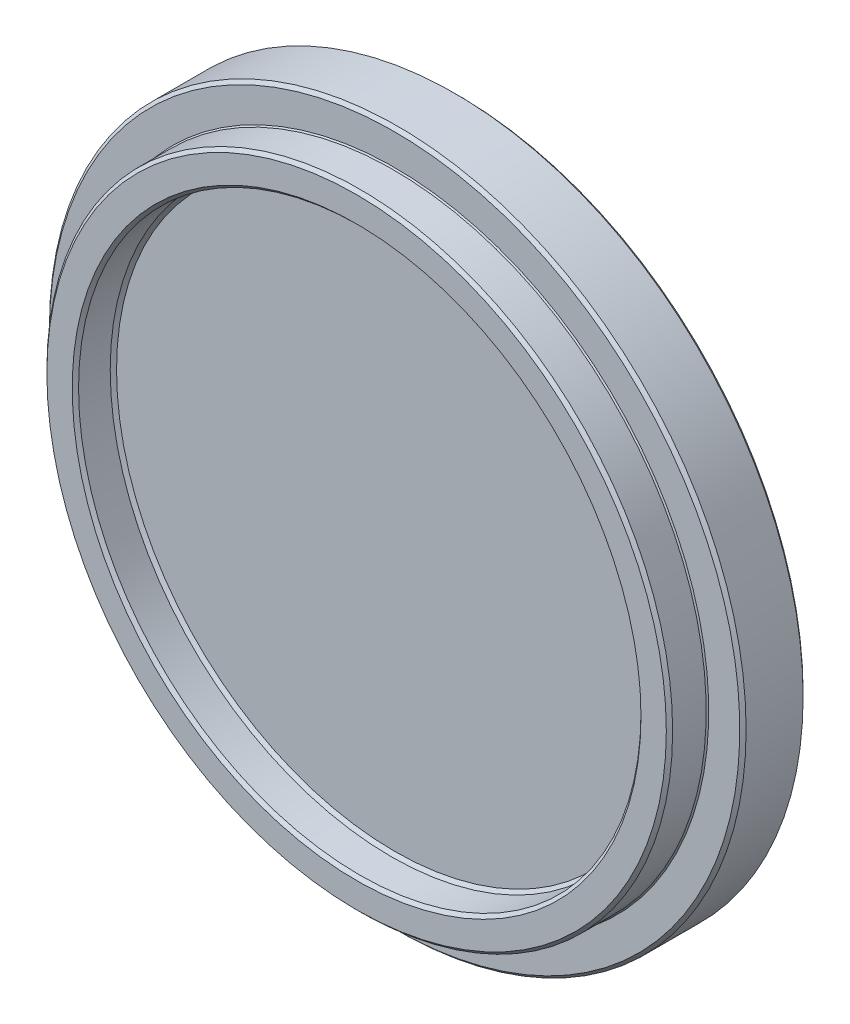
ISO-10303-21;
HEADER;
FILE_DESCRIPTION(('STEP AP214'),'2;1');
FILE_NAME('part.step','',(''),(''),'','','');
FILE_SCHEMA(('AUTOMOTIVE_DESIGN { 1 0 10303 214 1 1 1 1 }'));
ENDSEC;
DATA;
#1=APPLICATION_CONTEXT('core data for automotive mechanical design processes');
#2=APPLICATION_PROTOCOL_DEFINITION('international standard','automotive_design',2000,#1);
#3=PRODUCT_CONTEXT('',#1,'mechanical');
#4=PRODUCT('Part','Part','',(#3));
#5=PRODUCT_RELATED_PRODUCT_CATEGORY('part','',(#4));
#6=PRODUCT_DEFINITION_FORMATION('','',#4);
#7=PRODUCT_DEFINITION_CONTEXT('part definition',#1,'design');
#8=PRODUCT_DEFINITION('design','',#6,#7);
#9=PRODUCT_DEFINITION_SHAPE('','',#8);
#10=(LENGTH_UNIT() NAMED_UNIT(*) SI_UNIT(.MILLI.,.METRE.));
#11=(NAMED_UNIT(*) PLANE_ANGLE_UNIT() SI_UNIT($,.RADIAN.));
#12=(NAMED_UNIT(*) SI_UNIT($,.STERADIAN.) SOLID_ANGLE_UNIT());
#13=UNCERTAINTY_MEASURE_WITH_UNIT(LENGTH_MEASURE(1.E-05),#10,'distance_accuracy_value','');
#14=(GEOMETRIC_REPRESENTATION_CONTEXT(3) GLOBAL_UNCERTAINTY_ASSIGNED_CONTEXT((#13)) GLOBAL_UNIT_ASSIGNED_CONTEXT((#10,
#11,#12)) REPRESENTATION_CONTEXT('',''));
#15=CARTESIAN_POINT('',(0.,0.,0.));
#16=DIRECTION('',(0.,0.,1.));
#17=DIRECTION('',(1.,0.,0.));
#18=AXIS2_PLACEMENT_3D('',#15,#16,#17);
#19=CARTESIAN_POINT('',(0.0434435544244694,-0.0805622683892294,53.331012105136));
#20=DIRECTION('',(0.,0.,1.));
#21=DIRECTION('',(1.,0.,0.));
#22=AXIS2_PLACEMENT_3D('',#19,#20,#21);
#23=CYLINDRICAL_SURFACE('',#22,34.742856);
#24=CARTESIAN_POINT('',(0.0434435544244694,-0.0805622683892294,43.0167267301359));
#25=DIRECTION('',(0.,0.,1.));
#26=DIRECTION('',(1.,0.,0.));
#27=AXIS2_PLACEMENT_3D('',#24,#25,#26);
#28=CIRCLE('',#27,34.742856);
#29=CARTESIAN_POINT('',(34.7862995544245,-0.0805622683892294,43.0167267301359));
#30=VERTEX_POINT('',#29);
#31=EDGE_CURVE('E312',#30,#30,#28,.F.);
#32=ORIENTED_EDGE('',*,*,#31,.T.);
#33=EDGE_LOOP('',(#32));
#34=FACE_BOUND('',#33,.T.);
#35=CARTESIAN_POINT('',(-34.6782480958933,1.13194421694885,47.7985520332425));
#36=CARTESIAN_POINT('',(-34.4015014029592,9.05694375592085,47.1781438903853));
#37=CARTESIAN_POINT('',(-30.7136328158565,16.077045728757,46.5577357475282));
#38=CARTESIAN_POINT('',(-27.0257642287538,23.0971477015931,45.937327604671));
#39=CARTESIAN_POINT('',(-20.6572013498982,27.8219348166724,45.3169194618139));
#40=CARTESIAN_POINT('',(-14.2886384710427,32.5467219317518,44.6965113189568));
#41=CARTESIAN_POINT('',(-6.50075328388984,34.0403921552217,44.0761031760996));
#42=CARTESIAN_POINT('',(-2.65624503685832,34.7777460522653,43.7698372047324));
#43=CARTESIAN_POINT('',(1.25595003961298,34.6411293819338,43.4556950332545));
#44=(BOUNDED_CURVE() B_SPLINE_CURVE(2,(#35,#36,#37,#38,#39,#40,#41,#42,#43),.UNSPECIFIED.,.F.,
.F.) B_SPLINE_CURVE_WITH_KNOTS((3,2,2,2,3),(0.,0.0714285714285714,0.142857142857143,
0.214285714285714,0.249999999999317),
.UNSPECIFIED.) CURVE() GEOMETRIC_REPRESENTATION_ITEM() RATIONAL_B_SPLINE_CURVE((1.,
0.974927912181824,1.,0.974927912181824,1.,0.974927912181824,1.,0.987463956091152,0.987463956090912)) REPRESENTATION_ITEM(''));
#45=CARTESIAN_POINT('',(1.25595003961153,34.6411293819338,43.4556950332545));
#46=VERTEX_POINT('',#45);
#47=CARTESIAN_POINT('',(-34.5980988454337,2.5707738467735,47.6852980051359));
#48=VERTEX_POINT('',#47);
#49=EDGE_CURVE('E111',#46,#48,#44,.F.);
#50=ORIENTED_EDGE('',*,*,#49,.T.);
#51=CARTESIAN_POINT('',(0.0434435544244694,-0.0805622683892294,47.6852980051359));
#52=DIRECTION('',(0.,0.,1.));
#53=DIRECTION('',(1.,0.,0.));
#54=AXIS2_PLACEMENT_3D('',#51,#52,#53);
#55=CIRCLE('',#54,34.742856);
#56=CARTESIAN_POINT('',(1.25595003970553,34.6411293819306,47.6852980051359));
#57=VERTEX_POINT('',#56);
#58=EDGE_CURVE('E113',#48,#57,#55,.T.);
#59=ORIENTED_EDGE('',*,*,#58,.T.);
#60=DIRECTION('',(0.,0.,1.));
#61=VECTOR('',#60,1.);
#62=CARTESIAN_POINT('',(1.25595003970553,34.6411293819306,53.331012105136));
#63=LINE('',#62,#61);
#64=EDGE_CURVE('E109',#57,#46,#63,.F.);
#65=ORIENTED_EDGE('',*,*,#64,.T.);
#66=EDGE_LOOP('',(#50,#59,#65));
#67=FACE_BOUND('',#66,.T.);
#68=ADVANCED_FACE('F53',(#34,#67),#23,.F.);
#69=CARTESIAN_POINT('',(0.0434435544244694,-0.0805622683892294,47.902440855136));
#70=DIRECTION('',(0.,0.,1.));
#71=DIRECTION('',(1.,0.,0.));
#72=AXIS2_PLACEMENT_3D('',#69,#70,#71);
#73=PLANE('',#72);
#74=DIRECTION('',(-0.999390828730885,0.0348994476832326,0.));
#75=VECTOR('',#74,1.);
#76=CARTESIAN_POINT('',(0.0434435544244694,-0.0805622683892288,47.902440855136));
#77=LINE('',#76,#75);
#78=CARTESIAN_POINT('',(-28.7972615726208,0.926575930994717,47.902440855136));
#79=VERTEX_POINT('',#78);
#80=CARTESIAN_POINT('',(-34.4612375230789,1.12436605141549,47.902440855136));
#81=VERTEX_POINT('',#80);
#82=EDGE_CURVE('E116',#79,#81,#77,.T.);
#83=ORIENTED_EDGE('',*,*,#82,.F.);
#84=CARTESIAN_POINT('',(0.0434435544244694,-0.0805622683892294,47.902440855136));
#85=DIRECTION('',(0.,0.,1.));
#86=DIRECTION('',(1.,0.,0.));
#87=AXIS2_PLACEMENT_3D('',#84,#85,#86);
#88=CIRCLE('',#87,28.858284765);
#89=CARTESIAN_POINT('',(1.05058175371679,28.7601428586592,47.902440855136));
#90=VERTEX_POINT('',#89);
#91=EDGE_CURVE('E317',#79,#90,#88,.T.);
#92=ORIENTED_EDGE('',*,*,#91,.T.);
#93=DIRECTION('',(0.0348994476801973,0.999390828730991,0.));
#94=VECTOR('',#93,1.);
#95=CARTESIAN_POINT('',(0.043443554420435,-0.0805622683890885,47.902440855136));
#96=LINE('',#95,#94);
#97=CARTESIAN_POINT('',(1.24837187412036,34.4241188091179,47.902440855136));
#98=VERTEX_POINT('',#97);
#99=EDGE_CURVE('E117',#90,#98,#96,.T.);
#100=ORIENTED_EDGE('',*,*,#99,.T.);
#101=CARTESIAN_POINT('',(0.0434435544244694,-0.0805622683892294,47.902440855136));
#102=DIRECTION('',(0.,0.,1.));
#103=DIRECTION('',(1.,0.,0.));
#104=AXIS2_PLACEMENT_3D('',#101,#102,#103);
#105=CIRCLE('',#104,34.52571315);
#106=EDGE_CURVE('E315',#98,#81,#105,.F.);
#107=ORIENTED_EDGE('',*,*,#106,.T.);
#108=EDGE_LOOP('',(#83,#92,#100,#107));
#109=FACE_BOUND('',#108,.T.);
#110=ADVANCED_FACE('F174',(#109),#73,.F.);
#111=CARTESIAN_POINT('',(0.0434435544244694,-0.0805622683892294,53.331012105136));
#112=DIRECTION('',(0.,0.,1.));
#113=DIRECTION('',(1.,0.,0.));
#114=AXIS2_PLACEMENT_3D('',#111,#112,#113);
#115=CYLINDRICAL_SURFACE('',#114,28.641141915);
#116=CARTESIAN_POINT('',(0.0434435544244694,-0.0805622683892294,43.016726730136));
#117=DIRECTION('',(0.,0.,1.));
#118=DIRECTION('',(1.,0.,0.));
#119=AXIS2_PLACEMENT_3D('',#116,#117,#118);
#120=CIRCLE('',#119,28.641141915);
#121=CARTESIAN_POINT('',(28.6845854694245,-0.0805622683892294,43.016726730136));
#122=VERTEX_POINT('',#121);
#123=EDGE_CURVE('E306',#122,#122,#120,.T.);
#124=ORIENTED_EDGE('',*,*,#123,.T.);
#125=EDGE_LOOP('',(#124));
#126=FACE_BOUND('',#125,.T.);
#127=DIRECTION('',(0.,0.,1.));
#128=VECTOR('',#127,1.);
#129=CARTESIAN_POINT('',(1.04300358823655,28.5431322858429,53.331012105136));
#130=LINE('',#129,#128);
#131=CARTESIAN_POINT('',(1.04300358815175,28.5431322858458,43.4556950332545));
#132=VERTEX_POINT('',#131);
#133=CARTESIAN_POINT('',(1.04300358823655,28.5431322858429,47.685298005136));
#134=VERTEX_POINT('',#133);
#135=EDGE_CURVE('E131',#132,#134,#130,.T.);
#136=ORIENTED_EDGE('',*,*,#135,.T.);
#137=CARTESIAN_POINT('',(0.0434435544244694,-0.0805622683892294,47.685298005136));
#138=DIRECTION('',(0.,0.,1.));
#139=DIRECTION('',(1.,0.,0.));
#140=AXIS2_PLACEMENT_3D('',#137,#138,#139);
#141=CIRCLE('',#140,28.641141915);
#142=CARTESIAN_POINT('',(-28.5141779614586,2.10513294154774,47.685298005136));
#143=VERTEX_POINT('',#142);
#144=EDGE_CURVE('E339',#134,#143,#141,.F.);
#145=ORIENTED_EDGE('',*,*,#144,.T.);
#146=CARTESIAN_POINT('',(-28.5802509998063,0.918997765461354,47.7985520332425));
#147=CARTESIAN_POINT('',(-28.3521079448187,7.45216926040139,47.1781438903853));
#148=CARTESIAN_POINT('',(-25.3119212783259,13.2393658242582,46.5577357475282));
#149=CARTESIAN_POINT('',(-22.2717346118331,19.0265623881149,45.937327604671));
#150=CARTESIAN_POINT('',(-17.0216505885766,22.9215587661085,45.3169194618139));
#151=CARTESIAN_POINT('',(-11.7715665653201,26.816555144102,44.6965113189568));
#152=CARTESIAN_POINT('',(-5.35142871416089,28.047899534575,44.0761031760996));
#153=CARTESIAN_POINT('',(-2.18211222801428,28.6557556534503,43.7698372047324));
#154=CARTESIAN_POINT('',(1.04300358815175,28.5431322858458,43.4556950332545));
#155=(BOUNDED_CURVE() B_SPLINE_CURVE(2,(#146,#147,#148,#149,#150,#151,#152,#153,#154),
.UNSPECIFIED.,.F.,.F.) B_SPLINE_CURVE_WITH_KNOTS((3,2,2,2,3),(0.,0.0714285714285714,
0.142857142857143,0.214285714285714,0.249999999999317),
.UNSPECIFIED.) CURVE() GEOMETRIC_REPRESENTATION_ITEM() RATIONAL_B_SPLINE_CURVE((1.,
0.974927912181824,1.,0.974927912181824,1.,0.974927912181824,1.,0.987463956091152,0.987463956090912)) REPRESENTATION_ITEM(''));
#156=EDGE_CURVE('E327',#143,#132,#155,.T.);
#157=ORIENTED_EDGE('',*,*,#156,.T.);
#158=EDGE_LOOP('',(#136,#145,#157));
#159=FACE_BOUND('',#158,.T.);
#160=ADVANCED_FACE('F171',(#126,#159),#115,.T.);
#161=CARTESIAN_POINT('',(0.0434435544244372,-0.0805622683892294,42.473869605136));
#162=DIRECTION('',(0.,0.,1.));
#163=DIRECTION('',(1.,0.,0.));
#164=AXIS2_PLACEMENT_3D('',#161,#162,#163);
#165=PLANE('',#164);
#166=CARTESIAN_POINT('',(0.0434435544244694,-0.0805622683892294,42.473869605136));
#167=DIRECTION('',(0.,0.,1.));
#168=DIRECTION('',(1.,0.,0.));
#169=AXIS2_PLACEMENT_3D('',#166,#167,#168);
#170=CIRCLE('',#169,35.285713125);
#171=CARTESIAN_POINT('',(35.3291566794244,-0.0805622683892294,42.473869605136));
#172=VERTEX_POINT('',#171);
#173=EDGE_CURVE('E309',#172,#172,#170,.T.);
#174=ORIENTED_EDGE('',*,*,#173,.T.);
#175=EDGE_LOOP('',(#174));
#176=FACE_BOUND('',#175,.T.);
#177=CARTESIAN_POINT('',(0.0434435544244694,-0.0805622683892294,42.473869605136));
#178=DIRECTION('',(0.,0.,1.));
#179=DIRECTION('',(1.,0.,0.));
#180=AXIS2_PLACEMENT_3D('',#177,#178,#179);
#181=CIRCLE('',#180,59.171426626291);
#182=CARTESIAN_POINT('',(59.2148701807155,-0.0805622683892294,42.473869605136));
#183=VERTEX_POINT('',#182);
#184=EDGE_CURVE('E545',#183,#183,#181,.F.);
#185=ORIENTED_EDGE('',*,*,#184,.T.);
#186=EDGE_LOOP('',(#185));
#187=FACE_BOUND('',#186,.T.);
#188=ADVANCED_FACE('F169',(#176,#187),#165,.F.);
#189=CARTESIAN_POINT('',(0.0434435544244694,-0.0805622683892294,42.4738696051359));
#190=DIRECTION('',(0.,0.,1.));
#191=DIRECTION('',(1.,0.,0.));
#192=AXIS2_PLACEMENT_3D('',#189,#190,#191);
#193=PLANE('',#192);
#194=CARTESIAN_POINT('',(0.0434435544244694,-0.0805622683892294,42.4738696051359));
#195=DIRECTION('',(0.,0.,1.));
#196=DIRECTION('',(1.,0.,0.));
#197=AXIS2_PLACEMENT_3D('',#194,#195,#196);
#198=CIRCLE('',#197,20.4114279);
#199=CARTESIAN_POINT('',(20.4548714544245,-0.0805622683892294,42.4738696051359));
#200=VERTEX_POINT('',#199);
#201=EDGE_CURVE('E300',#200,#200,#198,.T.);
#202=ORIENTED_EDGE('',*,*,#201,.T.);
#203=EDGE_LOOP('',(#202));
#204=FACE_BOUND('',#203,.T.);
#205=CARTESIAN_POINT('',(0.0434435544244694,-0.0805622683892294,42.4738696051359));
#206=DIRECTION('',(0.,0.,1.));
#207=DIRECTION('',(1.,0.,0.));
#208=AXIS2_PLACEMENT_3D('',#205,#206,#207);
#209=CIRCLE('',#208,28.09828479);
#210=CARTESIAN_POINT('',(28.1417283444245,-0.0805622683892294,42.4738696051359));
#211=VERTEX_POINT('',#210);
#212=EDGE_CURVE('E297',#211,#211,#209,.F.);
#213=ORIENTED_EDGE('',*,*,#212,.T.);
#214=EDGE_LOOP('',(#213));
#215=FACE_BOUND('',#214,.T.);
#216=ADVANCED_FACE('F165',(#204,#215),#193,.F.);
#217=CARTESIAN_POINT('',(0.0434435544244694,-0.0805622683892294,53.331012105136));
#218=DIRECTION('',(0.,0.,1.));
#219=DIRECTION('',(1.,0.,0.));
#220=AXIS2_PLACEMENT_3D('',#217,#218,#219);
#221=CYLINDRICAL_SURFACE('',#220,19.868570775);
#222=CARTESIAN_POINT('',(0.0434435544244694,-0.0805622683892294,47.6852980051359));
#223=DIRECTION('',(0.,0.,-1.));
#224=DIRECTION('',(-1.,0.,0.));
#225=AXIS2_PLACEMENT_3D('',#222,#223,#224);
#226=CIRCLE('',#225,19.868570775);
#227=CARTESIAN_POINT('',(-19.8251272205755,-0.0805622683892294,47.6852980051359));
#228=VERTEX_POINT('',#227);
#229=EDGE_CURVE('E61',#228,#228,#226,.F.);
#230=ORIENTED_EDGE('',*,*,#229,.T.);
#231=EDGE_LOOP('',(#230));
#232=FACE_BOUND('',#231,.T.);
#233=CARTESIAN_POINT('',(0.0434435544244694,-0.0805622683892294,43.016726730136));
#234=DIRECTION('',(0.,0.,1.));
#235=DIRECTION('',(1.,0.,0.));
#236=AXIS2_PLACEMENT_3D('',#233,#234,#235);
#237=CIRCLE('',#236,19.868570775);
#238=CARTESIAN_POINT('',(19.9120143294245,-0.0805622683892294,43.016726730136));
#239=VERTEX_POINT('',#238);
#240=EDGE_CURVE('E303',#239,#239,#237,.F.);
#241=ORIENTED_EDGE('',*,*,#240,.T.);
#242=EDGE_LOOP('',(#241));
#243=FACE_BOUND('',#242,.T.);
#244=ADVANCED_FACE('F161',(#232,#243),#221,.F.);
#245=CARTESIAN_POINT('',(0.0434435544244694,-0.0805622683892294,47.902440855136));
#246=DIRECTION('',(0.,0.,-1.));
#247=DIRECTION('',(-1.,0.,0.));
#248=AXIS2_PLACEMENT_3D('',#245,#246,#247);
#249=PLANE('',#248);
#250=CARTESIAN_POINT('',(0.0434435544244694,-0.0805622683892294,47.902440855136));
#251=DIRECTION('',(0.,0.,-1.));
#252=DIRECTION('',(-1.,0.,0.));
#253=AXIS2_PLACEMENT_3D('',#250,#251,#252);
#254=CIRCLE('',#253,19.6514279249999);
#255=CARTESIAN_POINT('',(-19.6079843705755,-0.0805622683892294,47.902440855136));
#256=VERTEX_POINT('',#255);
#257=EDGE_CURVE('E12',#256,#256,#254,.T.);
#258=ORIENTED_EDGE('',*,*,#257,.T.);
#259=EDGE_LOOP('',(#258));
#260=FACE_BOUND('',#259,.T.);
#261=ADVANCED_FACE('F157',(#260),#249,.T.);
#262=CARTESIAN_POINT('',(0.0434435544244694,-0.0805622683892294,53.331012105136));
#263=DIRECTION('',(0.,0.,-1.));
#264=DIRECTION('',(-1.,0.,0.));
#265=AXIS2_PLACEMENT_3D('',#262,#263,#264);
#266=CYLINDRICAL_SURFACE('',#265,59.714283751291);
#267=CARTESIAN_POINT('',(0.0434435544244694,-0.0805622683892294,43.016726730136));
#268=DIRECTION('',(0.,0.,1.));
#269=DIRECTION('',(1.,0.,0.));
#270=AXIS2_PLACEMENT_3D('',#267,#268,#269);
#271=CIRCLE('',#270,59.714283751291);
#272=CARTESIAN_POINT('',(59.7577273057155,-0.0805622683892294,43.016726730136));
#273=VERTEX_POINT('',#272);
#274=EDGE_CURVE('E539',#273,#273,#271,.T.);
#275=ORIENTED_EDGE('',*,*,#274,.T.);
#276=EDGE_LOOP('',(#275));
#277=FACE_BOUND('',#276,.T.);
#278=CARTESIAN_POINT('',(0.0434435544244694,-0.0805622683892294,52.788154980136));
#279=DIRECTION('',(0.,0.,-1.));
#280=DIRECTION('',(-1.,0.,0.));
#281=AXIS2_PLACEMENT_3D('',#278,#279,#280);
#282=CIRCLE('',#281,59.714283751291);
#283=CARTESIAN_POINT('',(-59.6708401968666,-0.0805622683892294,52.788154980136));
#284=VERTEX_POINT('',#283);
#285=EDGE_CURVE('E532',#284,#284,#282,.T.);
#286=ORIENTED_EDGE('',*,*,#285,.T.);
#287=EDGE_LOOP('',(#286));
#288=FACE_BOUND('',#287,.T.);
#289=ADVANCED_FACE('F153',(#277,#288),#266,.T.);
#290=CARTESIAN_POINT('',(0.0434435544244899,-0.0805622683892294,53.331012105136));
#291=DIRECTION('',(0.,0.,-1.));
#292=DIRECTION('',(-1.,0.,0.));
#293=AXIS2_PLACEMENT_3D('',#290,#291,#292);
#294=PLANE('',#293);
#295=CARTESIAN_POINT('',(0.0434435544244694,-0.0805622683892294,53.331012105136));
#296=DIRECTION('',(0.,0.,-1.));
#297=DIRECTION('',(-1.,0.,0.));
#298=AXIS2_PLACEMENT_3D('',#295,#296,#297);
#299=CIRCLE('',#298,53.8514268);
#300=CARTESIAN_POINT('',(-53.8079832455755,-0.0805622683892294,53.331012105136));
#301=VERTEX_POINT('',#300);
#302=EDGE_CURVE('E285',#301,#301,#299,.T.);
#303=ORIENTED_EDGE('',*,*,#302,.T.);
#304=EDGE_LOOP('',(#303));
#305=FACE_BOUND('',#304,.T.);
#306=CARTESIAN_POINT('',(0.0434435544244694,-0.0805622683892294,53.331012105136));
#307=DIRECTION('',(0.,0.,-1.));
#308=DIRECTION('',(-1.,0.,0.));
#309=AXIS2_PLACEMENT_3D('',#306,#307,#308);
#310=CIRCLE('',#309,59.171426626291);
#311=CARTESIAN_POINT('',(-59.1279830718666,-0.0805622683892294,53.331012105136));
#312=VERTEX_POINT('',#311);
#313=EDGE_CURVE('E534',#312,#312,#310,.F.);
#314=ORIENTED_EDGE('',*,*,#313,.T.);
#315=EDGE_LOOP('',(#314));
#316=FACE_BOUND('',#315,.T.);
#317=ADVANCED_FACE('F156',(#305,#316),#294,.F.);
#318=CARTESIAN_POINT('',(-31.6847405232967,1.02740877604245,52.6625518732425));
#319=DIRECTION('',(0.0348994476832326,0.999390828730885,0.));
#320=DIRECTION('',(-0.999390828730885,0.0348994476832326,0.));
#321=AXIS2_PLACEMENT_3D('',#318,#319,#320);
#322=PLANE('',#321);
#323=DIRECTION('',(-0.999390828730885,0.0348994476832326,0.));
#324=VECTOR('',#323,1.);
#325=CARTESIAN_POINT('',(-31.6847405232966,1.02740877604245,47.7985520332425));
#326=LINE('',#325,#324);
#327=CARTESIAN_POINT('',(-28.6934360368128,0.922950268490173,47.7985520332425));
#328=VERTEX_POINT('',#327);
#329=CARTESIAN_POINT('',(-34.5650630588868,1.12799171392004,47.7985520332425));
#330=VERTEX_POINT('',#329);
#331=EDGE_CURVE('E132',#328,#330,#326,.T.);
#332=ORIENTED_EDGE('',*,*,#331,.F.);
#333=DIRECTION('',(-0.706676032051253,0.0246776361164789,0.707106781186548));
#334=VECTOR('',#333,1.);
#335=CARTESIAN_POINT('',(0.0434435544244695,-0.0805622683892282,19.044156090136));
#336=LINE('',#335,#334);
#337=EDGE_CURVE('E347',#328,#79,#336,.T.);
#338=ORIENTED_EDGE('',*,*,#337,.T.);
#339=ORIENTED_EDGE('',*,*,#82,.T.);
#340=DIRECTION('',(0.706676032051216,-0.0246776361164776,0.707106781186584));
#341=VECTOR('',#340,1.);
#342=CARTESIAN_POINT('',(0.0434435544244694,-0.0805622683892296,82.4281540051395));
#343=LINE('',#342,#341);
#344=EDGE_CURVE('E68',#81,#330,#343,.F.);
#345=ORIENTED_EDGE('',*,*,#344,.T.);
#346=EDGE_LOOP('',(#332,#338,#339,#345));
#347=FACE_BOUND('',#346,.T.);
#348=ADVANCED_FACE('F152',(#347),#322,.F.);
#349=CARTESIAN_POINT('',(1.08192541766092,29.6577092203852,48.3196948732509));
#350=DIRECTION('',(0.999390828730991,-0.0348994476801973,-9.67047945020191E-12));
#351=DIRECTION('',(0.0348994476801973,0.999390828730991,0.));
#352=AXIS2_PLACEMENT_3D('',#349,#350,#351);
#353=PLANE('',#352);
#354=ORIENTED_EDGE('',*,*,#99,.F.);
#355=DIRECTION('',(0.0246776361211665,0.706676032051089,0.707106781186548));
#356=VECTOR('',#355,1.);
#357=CARTESIAN_POINT('',(0.0434435541415315,-0.080562268379349,19.044156090136));
#358=LINE('',#357,#356);
#359=EDGE_CURVE('E338',#90,#134,#358,.F.);
#360=ORIENTED_EDGE('',*,*,#359,.T.);
#361=ORIENTED_EDGE('',*,*,#135,.F.);
#362=CARTESIAN_POINT('',(1.29039296091213,35.6274469872369,43.4556950332545));
#363=CARTESIAN_POINT('',(1.01243623652681,27.6677966314364,43.4556950332545));
#364=(BOUNDED_CURVE() B_SPLINE_CURVE(1,(#362,#363),.UNSPECIFIED.,.F.,
.F.) B_SPLINE_CURVE_WITH_KNOTS((2,2),(0.,1.),
.UNSPECIFIED.) CURVE() GEOMETRIC_REPRESENTATION_ITEM() RATIONAL_B_SPLINE_CURVE((0.987463956090912,0.987463956090912)) REPRESENTATION_ITEM(''));
#365=EDGE_CURVE('E121',#46,#132,#364,.T.);
#366=ORIENTED_EDGE('',*,*,#365,.F.);
#367=ORIENTED_EDGE('',*,*,#64,.F.);
#368=DIRECTION('',(-0.0246776361074974,-0.706676032051529,0.707106781186584));
#369=VECTOR('',#368,1.);
#370=CARTESIAN_POINT('',(0.0434435547541118,-0.0805622684007408,82.4281540051395));
#371=LINE('',#370,#369);
#372=EDGE_CURVE('E319',#57,#98,#371,.T.);
#373=ORIENTED_EDGE('',*,*,#372,.T.);
#374=EDGE_LOOP('',(#354,#360,#361,#366,#367,#373));
#375=FACE_BOUND('',#374,.T.);
#376=ADVANCED_FACE('F129',(#375),#353,.T.);
#377=CARTESIAN_POINT('',(-27.704915345397,0.888430413832643,47.7985520332425));
#378=CARTESIAN_POINT('',(-27.483749088948,7.22181225775273,47.1781438903853));
#379=CARTESIAN_POINT('',(-24.5365337815577,12.8320316853484,46.5577357475282));
#380=CARTESIAN_POINT('',(-21.5893184741674,18.4422511129441,45.937327604671));
#381=CARTESIAN_POINT('',(-16.499786252688,22.2181353617542,45.3169194618139));
#382=CARTESIAN_POINT('',(-11.4102540312087,25.9940196105642,44.6965113189568));
#383=CARTESIAN_POINT('',(-5.18644917112077,27.1877084969305,44.0761031760996));
#384=CARTESIAN_POINT('',(-2.11405293805943,27.7769758856684,43.7698372047324));
#385=CARTESIAN_POINT('',(1.01243623652681,27.6677966314364,43.4556950332545));
#386=CARTESIAN_POINT('',(-35.6645657011963,1.16638713825226,47.7985520332425));
#387=CARTESIAN_POINT('',(-35.3799576362357,9.31650723431077,47.1781438903853));
#388=CARTESIAN_POINT('',(-31.5873300486173,16.5360248991173,46.5577357475282));
#389=CARTESIAN_POINT('',(-27.7947024609988,23.7555425639237,45.937327604671));
#390=CARTESIAN_POINT('',(-21.2452317579752,28.6145437823897,45.3169194618139));
#391=CARTESIAN_POINT('',(-14.6957610549516,33.4735450008556,44.6965113189568));
#392=CARTESIAN_POINT('',(-6.68665023324364,35.0096449899245,44.0761031760996));
#393=CARTESIAN_POINT('',(-2.73293341982175,35.7679444427699,43.7698372047324));
#394=CARTESIAN_POINT('',(1.29039296091213,35.6274469872369,43.4556950332545));
#395=(BOUNDED_SURFACE() B_SPLINE_SURFACE(1,2,((#377,#378,#379,#380,#381,#382,#383,#384,#385),
(#386,#387,#388,#389,#390,#391,#392,#393,#394)),.UNSPECIFIED.,.F.,.F.,
.F.) B_SPLINE_SURFACE_WITH_KNOTS((2,2),(3,2,2,2,3),(0.,1.),(0.,0.0714285714285714,
0.142857142857143,0.214285714285714,0.249999999999317),
.UNSPECIFIED.) GEOMETRIC_REPRESENTATION_ITEM() RATIONAL_B_SPLINE_SURFACE(((1.,0.974927912181824,
1.,0.974927912181824,1.,0.974927912181824,1.,0.987463956091152,0.987463956090912),(1.,
0.974927912181824,1.,0.974927912181824,1.,0.974927912181824,1.,0.987463956091152,0.987463956090912))) REPRESENTATION_ITEM('') SURFACE());
#396=CARTESIAN_POINT('',(-28.5141779614586,2.10513294154772,47.685298005136));
#397=CARTESIAN_POINT('',(-28.5482555430796,1.90875065587047,47.7042896802405));
#398=CARTESIAN_POINT('',(-28.5802325068362,1.71204429027705,47.7232233534682));
#399=CARTESIAN_POINT('',(-28.639985198621,1.31798339925787,47.7609746961704));
#400=CARTESIAN_POINT('',(-28.667760926649,1.12062887383211,47.7797923656448));
#401=CARTESIAN_POINT('',(-28.6934360368128,0.922950268490173,47.7985520332425));
#402=B_SPLINE_CURVE_WITH_KNOTS('',3,(#396,#397,#398,#399,#400,#401),.UNSPECIFIED.,.F.,.F.,(4,2,
4),(0.,0.6005577741747,1.2011155483494),.UNSPECIFIED.);
#403=EDGE_CURVE('E75',#143,#328,#402,.T.);
#404=CARTESIAN_POINT('',(-34.5650630588868,1.12799171392004,47.7985520332425));
#405=CARTESIAN_POINT('',(-34.5755067399502,1.36834622198992,47.779725784711));
#406=CARTESIAN_POINT('',(-34.5834815626941,1.60875532042932,47.7608748247697));
#407=CARTESIAN_POINT('',(-34.5944934915431,2.08968269804713,47.7231234820676));
#408=CARTESIAN_POINT('',(-34.5975305976481,2.33020097722554,47.7042230993067));
#409=CARTESIAN_POINT('',(-34.5980988454337,2.57077384677347,47.6852980051359));
#410=B_SPLINE_CURVE_WITH_KNOTS('',3,(#404,#405,#406,#407,#408,#409),.UNSPECIFIED.,.F.,.F.,(4,2,
4),(0.,0.723836597519447,1.44767319503889),.UNSPECIFIED.);
#411=EDGE_CURVE('E125',#330,#48,#410,.T.);
#412=ORIENTED_EDGE('',*,*,#156,.F.);
#413=ORIENTED_EDGE('',*,*,#403,.T.);
#414=ORIENTED_EDGE('',*,*,#331,.T.);
#415=ORIENTED_EDGE('',*,*,#411,.T.);
#416=ORIENTED_EDGE('',*,*,#49,.F.);
#417=ORIENTED_EDGE('',*,*,#365,.T.);
#418=EDGE_LOOP('',(#412,#413,#414,#415,#416,#417));
#419=FACE_BOUND('',#418,.T.);
#420=ADVANCED_FACE('F120',(#419),#395,.T.);
#421=CARTESIAN_POINT('',(0.0434435544244694,-0.0805622683892294,59.845297605136));
#422=DIRECTION('',(0.,0.,1.));
#423=DIRECTION('',(1.,0.,0.));
#424=AXIS2_PLACEMENT_3D('',#421,#422,#423);
#425=PLANE('',#424);
#426=CARTESIAN_POINT('',(0.0434435544244694,-0.0805622683892294,59.845297605136));
#427=DIRECTION('',(0.,0.,1.));
#428=DIRECTION('',(1.,0.,0.));
#429=AXIS2_PLACEMENT_3D('',#426,#427,#428);
#430=CIRCLE('',#429,48.748569825);
#431=CARTESIAN_POINT('',(48.7920133794245,-0.0805622683892294,59.845297605136));
#432=VERTEX_POINT('',#431);
#433=EDGE_CURVE('E291',#432,#432,#430,.F.);
#434=ORIENTED_EDGE('',*,*,#433,.T.);
#435=EDGE_LOOP('',(#434));
#436=FACE_BOUND('',#435,.T.);
#437=CARTESIAN_POINT('',(0.0434435544244694,-0.0805622683892294,59.845297605136));
#438=DIRECTION('',(0.,0.,1.));
#439=DIRECTION('',(1.,0.,0.));
#440=AXIS2_PLACEMENT_3D('',#437,#438,#439);
#441=CIRCLE('',#440,53.091426825);
#442=CARTESIAN_POINT('',(53.1348703794245,-0.0805622683892294,59.845297605136));
#443=VERTEX_POINT('',#442);
#444=EDGE_CURVE('E282',#443,#443,#441,.T.);
#445=ORIENTED_EDGE('',*,*,#444,.T.);
#446=EDGE_LOOP('',(#445));
#447=FACE_BOUND('',#446,.T.);
#448=ADVANCED_FACE('F249',(#436,#447),#425,.T.);
#449=CARTESIAN_POINT('',(0.0434435544244694,-0.0805622683892294,59.845297605136));
#450=DIRECTION('',(0.,0.,-1.));
#451=DIRECTION('',(-1.,0.,0.));
#452=AXIS2_PLACEMENT_3D('',#449,#450,#451);
#453=CYLINDRICAL_SURFACE('',#452,53.63428395);
#454=CARTESIAN_POINT('',(0.0434435544244694,-0.0805622683892294,59.302440480136));
#455=DIRECTION('',(0.,0.,1.));
#456=DIRECTION('',(1.,0.,0.));
#457=AXIS2_PLACEMENT_3D('',#454,#455,#456);
#458=CIRCLE('',#457,53.63428395);
#459=CARTESIAN_POINT('',(53.6777275044245,-0.0805622683892294,59.302440480136));
#460=VERTEX_POINT('',#459);
#461=EDGE_CURVE('E294',#460,#460,#458,.F.);
#462=ORIENTED_EDGE('',*,*,#461,.T.);
#463=EDGE_LOOP('',(#462));
#464=FACE_BOUND('',#463,.T.);
#465=CARTESIAN_POINT('',(0.0434435544244694,-0.0805622683892294,53.548154955136));
#466=DIRECTION('',(0.,0.,-1.));
#467=DIRECTION('',(-1.,0.,0.));
#468=AXIS2_PLACEMENT_3D('',#465,#466,#467);
#469=CIRCLE('',#468,53.63428395);
#470=CARTESIAN_POINT('',(-53.5908403955755,-0.0805622683892294,53.548154955136));
#471=VERTEX_POINT('',#470);
#472=EDGE_CURVE('E548',#471,#471,#469,.F.);
#473=ORIENTED_EDGE('',*,*,#472,.T.);
#474=EDGE_LOOP('',(#473));
#475=FACE_BOUND('',#474,.T.);
#476=ADVANCED_FACE('F250',(#464,#475),#453,.T.);
#477=CARTESIAN_POINT('',(0.0434435544244694,-0.0805622683892294,59.845297605136));
#478=DIRECTION('',(0.,0.,-1.));
#479=DIRECTION('',(-1.,0.,0.));
#480=AXIS2_PLACEMENT_3D('',#477,#478,#479);
#481=CYLINDRICAL_SURFACE('',#480,48.2057127);
#482=CARTESIAN_POINT('',(0.0434435544244694,-0.0805622683892294,53.8738692301359));
#483=DIRECTION('',(0.,0.,-1.));
#484=DIRECTION('',(-1.,0.,0.));
#485=AXIS2_PLACEMENT_3D('',#482,#483,#484);
#486=CIRCLE('',#485,48.2057127);
#487=CARTESIAN_POINT('',(-48.1622691455755,-0.0805622683892294,53.8738692301359));
#488=VERTEX_POINT('',#487);
#489=EDGE_CURVE('E275',#488,#488,#486,.T.);
#490=ORIENTED_EDGE('',*,*,#489,.T.);
#491=EDGE_LOOP('',(#490));
#492=FACE_BOUND('',#491,.T.);
#493=CARTESIAN_POINT('',(0.0434435544244694,-0.0805622683892294,59.302440480136));
#494=DIRECTION('',(0.,0.,1.));
#495=DIRECTION('',(1.,0.,0.));
#496=AXIS2_PLACEMENT_3D('',#493,#494,#495);
#497=CIRCLE('',#496,48.2057127);
#498=CARTESIAN_POINT('',(48.2491562544245,-0.0805622683892294,59.302440480136));
#499=VERTEX_POINT('',#498);
#500=EDGE_CURVE('E278',#499,#499,#497,.T.);
#501=ORIENTED_EDGE('',*,*,#500,.T.);
#502=EDGE_LOOP('',(#501));
#503=FACE_BOUND('',#502,.T.);
#504=ADVANCED_FACE('F261',(#492,#503),#481,.F.);
#505=CARTESIAN_POINT('',(0.0434435544244694,-0.0805622683892294,53.331012105136));
#506=DIRECTION('',(0.,0.,-1.));
#507=DIRECTION('',(-1.,0.,0.));
#508=AXIS2_PLACEMENT_3D('',#505,#506,#507);
#509=CIRCLE('',#508,47.662855575);
#510=CARTESIAN_POINT('',(-47.6194120205756,-0.0805622683892294,53.331012105136));
#511=VERTEX_POINT('',#510);
#512=EDGE_CURVE('E280',#511,#511,#509,.F.);
#513=ORIENTED_EDGE('',*,*,#512,.T.);
#514=EDGE_LOOP('',(#513));
#515=FACE_BOUND('',#514,.T.);
#516=ADVANCED_FACE('F188',(#515),#294,.F.);
#517=CARTESIAN_POINT('',(0.0434435544244694,-0.0805622683892294,52.788154980136));
#518=DIRECTION('',(0.,0.,-1.));
#519=DIRECTION('',(-1.,0.,0.));
#520=AXIS2_PLACEMENT_3D('',#517,#518,#519);
#521=CONICAL_SURFACE('',#520,59.714283751291,0.785398163397462);
#522=ORIENTED_EDGE('',*,*,#313,.F.);
#523=EDGE_LOOP('',(#522));
#524=FACE_BOUND('',#523,.T.);
#525=ORIENTED_EDGE('',*,*,#285,.F.);
#526=EDGE_LOOP('',(#525));
#527=FACE_BOUND('',#526,.T.);
#528=ADVANCED_FACE('F189',(#524,#527),#521,.T.);
#529=CARTESIAN_POINT('',(0.0434435544244694,-0.0805622683892294,43.016726730136));
#530=DIRECTION('',(0.,0.,1.));
#531=DIRECTION('',(1.,0.,0.));
#532=AXIS2_PLACEMENT_3D('',#529,#530,#531);
#533=CONICAL_SURFACE('',#532,59.714283751291,0.785398163397448);
#534=ORIENTED_EDGE('',*,*,#184,.F.);
#535=EDGE_LOOP('',(#534));
#536=FACE_BOUND('',#535,.T.);
#537=ORIENTED_EDGE('',*,*,#274,.F.);
#538=EDGE_LOOP('',(#537));
#539=FACE_BOUND('',#538,.T.);
#540=ADVANCED_FACE('F192',(#536,#539),#533,.T.);
#541=CARTESIAN_POINT('',(0.0434435544244694,-0.0805622683892294,53.548154955136));
#542=DIRECTION('',(0.,0.,-1.));
#543=DIRECTION('',(-1.,0.,0.));
#544=AXIS2_PLACEMENT_3D('',#541,#542,#543);
#545=CONICAL_SURFACE('',#544,53.63428395,0.785398163397448);
#546=ORIENTED_EDGE('',*,*,#302,.F.);
#547=EDGE_LOOP('',(#546));
#548=FACE_BOUND('',#547,.T.);
#549=ORIENTED_EDGE('',*,*,#472,.F.);
#550=EDGE_LOOP('',(#549));
#551=FACE_BOUND('',#550,.T.);
#552=ADVANCED_FACE('F196',(#548,#551),#545,.T.);
#553=CARTESIAN_POINT('',(0.0434435544244694,-0.0805622683892294,53.331012105136));
#554=DIRECTION('',(0.,0.,1.));
#555=DIRECTION('',(1.,0.,0.));
#556=AXIS2_PLACEMENT_3D('',#553,#554,#555);
#557=CONICAL_SURFACE('',#556,47.662855575,0.785398163397455);
#558=ORIENTED_EDGE('',*,*,#489,.F.);
#559=EDGE_LOOP('',(#558));
#560=FACE_BOUND('',#559,.T.);
#561=ORIENTED_EDGE('',*,*,#512,.F.);
#562=EDGE_LOOP('',(#561));
#563=FACE_BOUND('',#562,.T.);
#564=ADVANCED_FACE('F200',(#560,#563),#557,.F.);
#565=CARTESIAN_POINT('',(0.0434435544244694,-0.0805622683892294,59.302440480136));
#566=DIRECTION('',(0.,0.,1.));
#567=DIRECTION('',(1.,0.,0.));
#568=AXIS2_PLACEMENT_3D('',#565,#566,#567);
#569=CONICAL_SURFACE('',#568,48.2057127,0.785398163397462);
#570=ORIENTED_EDGE('',*,*,#433,.F.);
#571=EDGE_LOOP('',(#570));
#572=FACE_BOUND('',#571,.T.);
#573=ORIENTED_EDGE('',*,*,#500,.F.);
#574=EDGE_LOOP('',(#573));
#575=FACE_BOUND('',#574,.T.);
#576=ADVANCED_FACE('F204',(#572,#575),#569,.F.);
#577=CARTESIAN_POINT('',(0.0434435544244694,-0.0805622683892294,59.845297605136));
#578=DIRECTION('',(0.,0.,-1.));
#579=DIRECTION('',(-1.,0.,0.));
#580=AXIS2_PLACEMENT_3D('',#577,#578,#579);
#581=CONICAL_SURFACE('',#580,53.091426825,0.785398163397483);
#582=ORIENTED_EDGE('',*,*,#461,.F.);
#583=EDGE_LOOP('',(#582));
#584=FACE_BOUND('',#583,.T.);
#585=ORIENTED_EDGE('',*,*,#444,.F.);
#586=EDGE_LOOP('',(#585));
#587=FACE_BOUND('',#586,.T.);
#588=ADVANCED_FACE('F208',(#584,#587),#581,.T.);
#589=CARTESIAN_POINT('',(0.0434435544244694,-0.0805622683892294,42.4738696051359));
#590=DIRECTION('',(0.,0.,-1.));
#591=DIRECTION('',(-1.,0.,0.));
#592=AXIS2_PLACEMENT_3D('',#589,#590,#591);
#593=CONICAL_SURFACE('',#592,20.4114279,0.785398163397445);
#594=ORIENTED_EDGE('',*,*,#240,.F.);
#595=EDGE_LOOP('',(#594));
#596=FACE_BOUND('',#595,.T.);
#597=ORIENTED_EDGE('',*,*,#201,.F.);
#598=EDGE_LOOP('',(#597));
#599=FACE_BOUND('',#598,.T.);
#600=ADVANCED_FACE('F212',(#596,#599),#593,.F.);
#601=CARTESIAN_POINT('',(0.0434435544244694,-0.0805622683892294,43.016726730136));
#602=DIRECTION('',(0.,0.,1.));
#603=DIRECTION('',(1.,0.,0.));
#604=AXIS2_PLACEMENT_3D('',#601,#602,#603);
#605=CONICAL_SURFACE('',#604,28.641141915,0.785398163397448);
#606=ORIENTED_EDGE('',*,*,#212,.F.);
#607=EDGE_LOOP('',(#606));
#608=FACE_BOUND('',#607,.T.);
#609=ORIENTED_EDGE('',*,*,#123,.F.);
#610=EDGE_LOOP('',(#609));
#611=FACE_BOUND('',#610,.T.);
#612=ADVANCED_FACE('F216',(#608,#611),#605,.T.);
#613=CARTESIAN_POINT('',(0.0434435544244694,-0.0805622683892294,42.473869605136));
#614=DIRECTION('',(0.,0.,-1.));
#615=DIRECTION('',(-1.,0.,0.));
#616=AXIS2_PLACEMENT_3D('',#613,#614,#615);
#617=CONICAL_SURFACE('',#616,35.285713125,0.785398163397462);
#618=ORIENTED_EDGE('',*,*,#31,.F.);
#619=EDGE_LOOP('',(#618));
#620=FACE_BOUND('',#619,.T.);
#621=ORIENTED_EDGE('',*,*,#173,.F.);
#622=EDGE_LOOP('',(#621));
#623=FACE_BOUND('',#622,.T.);
#624=ADVANCED_FACE('F220',(#620,#623),#617,.F.);
#625=CARTESIAN_POINT('',(0.0434435544244694,-0.0805622683892294,47.902440855136));
#626=DIRECTION('',(0.,0.,1.));
#627=DIRECTION('',(1.,0.,0.));
#628=AXIS2_PLACEMENT_3D('',#625,#626,#627);
#629=CONICAL_SURFACE('',#628,28.858284765,0.785398163397448);
#630=ORIENTED_EDGE('',*,*,#403,.F.);
#631=ORIENTED_EDGE('',*,*,#144,.F.);
#632=ORIENTED_EDGE('',*,*,#359,.F.);
#633=ORIENTED_EDGE('',*,*,#91,.F.);
#634=ORIENTED_EDGE('',*,*,#337,.F.);
#635=EDGE_LOOP('',(#630,#631,#632,#633,#634));
#636=FACE_BOUND('',#635,.T.);
#637=ADVANCED_FACE('F224',(#636),#629,.T.);
#638=CARTESIAN_POINT('',(0.0434435544244694,-0.0805622683892294,47.6852980051359));
#639=DIRECTION('',(0.,0.,-1.));
#640=DIRECTION('',(-1.,0.,0.));
#641=AXIS2_PLACEMENT_3D('',#638,#639,#640);
#642=CONICAL_SURFACE('',#641,34.742856,0.785398163397396);
#643=ORIENTED_EDGE('',*,*,#344,.F.);
#644=ORIENTED_EDGE('',*,*,#106,.F.);
#645=ORIENTED_EDGE('',*,*,#372,.F.);
#646=ORIENTED_EDGE('',*,*,#58,.F.);
#647=ORIENTED_EDGE('',*,*,#411,.F.);
#648=EDGE_LOOP('',(#643,#644,#645,#646,#647));
#649=FACE_BOUND('',#648,.T.);
#650=ADVANCED_FACE('F228',(#649),#642,.F.);
#651=CARTESIAN_POINT('',(0.0434435544244694,-0.0805622683892294,47.6852980051359));
#652=DIRECTION('',(0.,0.,-1.));
#653=DIRECTION('',(-1.,0.,0.));
#654=AXIS2_PLACEMENT_3D('',#651,#652,#653);
#655=CONICAL_SURFACE('',#654,19.868570775,0.785398163397457);
#656=ORIENTED_EDGE('',*,*,#257,.F.);
#657=EDGE_LOOP('',(#656));
#658=FACE_BOUND('',#657,.T.);
#659=ORIENTED_EDGE('',*,*,#229,.F.);
#660=EDGE_LOOP('',(#659));
#661=FACE_BOUND('',#660,.T.);
#662=ADVANCED_FACE('F55',(#658,#661),#655,.F.);
#663=CLOSED_SHELL('',(#68,#110,#160,#188,#216,#244,#261,#289,#317,#348,#376,#420,#448,#476,#504,
#516,#528,#540,#552,#564,#576,#588,#600,#612,#624,#637,#650,#662));
#664=MANIFOLD_SOLID_BREP('B2',#663);
#665=ADVANCED_BREP_SHAPE_REPRESENTATION('',(#18,#664),#14);
#666=SHAPE_DEFINITION_REPRESENTATION(#9,#665);
ENDSEC;
END-ISO-10303-21;
